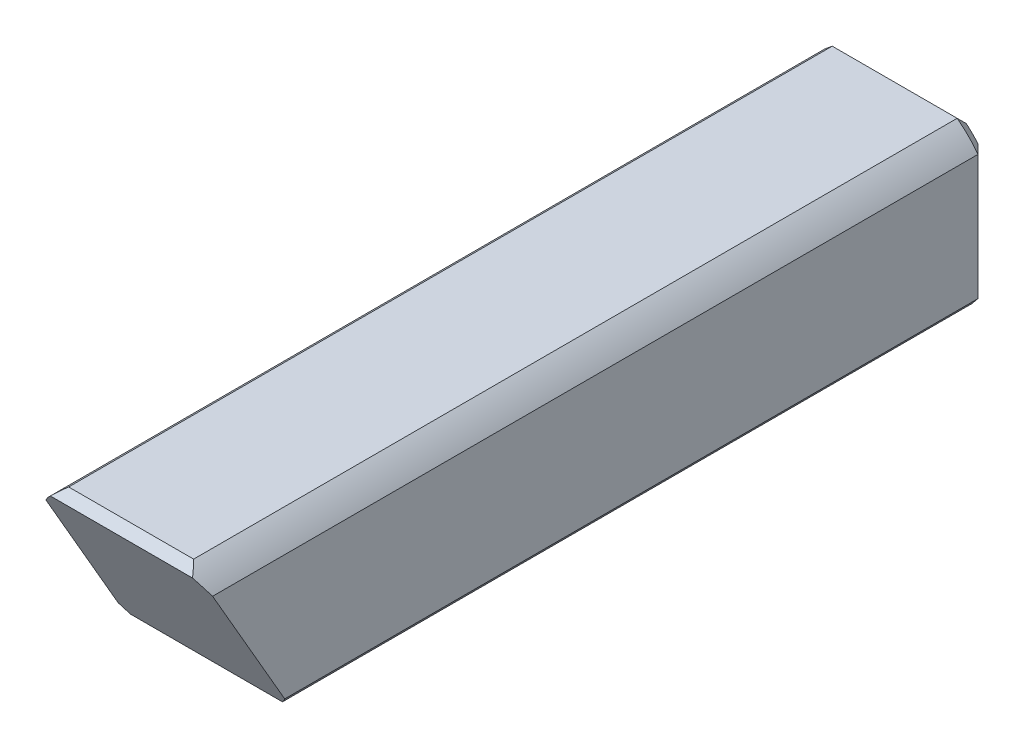
ISO-10303-21;
HEADER;
FILE_DESCRIPTION(('STEP AP214'),'2;1');
FILE_NAME('part.step','',(''),(''),'','','');
FILE_SCHEMA(('AUTOMOTIVE_DESIGN { 1 0 10303 214 1 1 1 1 }'));
ENDSEC;
DATA;
#1=APPLICATION_CONTEXT('core data for automotive mechanical design processes');
#2=APPLICATION_PROTOCOL_DEFINITION('international standard','automotive_design',2000,#1);
#3=PRODUCT_CONTEXT('',#1,'mechanical');
#4=PRODUCT('Part','Part','',(#3));
#5=PRODUCT_RELATED_PRODUCT_CATEGORY('part','',(#4));
#6=PRODUCT_DEFINITION_FORMATION('','',#4);
#7=PRODUCT_DEFINITION_CONTEXT('part definition',#1,'design');
#8=PRODUCT_DEFINITION('design','',#6,#7);
#9=PRODUCT_DEFINITION_SHAPE('','',#8);
#10=(LENGTH_UNIT() NAMED_UNIT(*) SI_UNIT(.MILLI.,.METRE.));
#11=(NAMED_UNIT(*) PLANE_ANGLE_UNIT() SI_UNIT($,.RADIAN.));
#12=(NAMED_UNIT(*) SI_UNIT($,.STERADIAN.) SOLID_ANGLE_UNIT());
#13=UNCERTAINTY_MEASURE_WITH_UNIT(LENGTH_MEASURE(1.E-05),#10,'distance_accuracy_value','');
#14=(GEOMETRIC_REPRESENTATION_CONTEXT(3) GLOBAL_UNCERTAINTY_ASSIGNED_CONTEXT((#13)) GLOBAL_UNIT_ASSIGNED_CONTEXT((#10,
#11,#12)) REPRESENTATION_CONTEXT('',''));
#15=CARTESIAN_POINT('',(0.,0.,0.));
#16=DIRECTION('',(0.,0.,1.));
#17=DIRECTION('',(1.,0.,0.));
#18=AXIS2_PLACEMENT_3D('',#15,#16,#17);
#19=CARTESIAN_POINT('',(-30.,30.,285.));
#20=DIRECTION('',(1.,0.,0.));
#21=DIRECTION('',(0.,1.,0.));
#22=AXIS2_PLACEMENT_3D('',#19,#20,#21);
#23=PLANE('',#22);
#24=DIRECTION('',(0.,0.,-1.));
#25=VECTOR('',#24,1.);
#26=CARTESIAN_POINT('',(-30.,22.5,285.));
#27=LINE('',#26,#25);
#28=CARTESIAN_POINT('',(-30.,22.5,4.99999999999995));
#29=VERTEX_POINT('',#28);
#30=CARTESIAN_POINT('',(-30.,22.5,280.669872981078));
#31=VERTEX_POINT('',#30);
#32=EDGE_CURVE('E332',#29,#31,#27,.F.);
#33=ORIENTED_EDGE('',*,*,#32,.F.);
#34=DIRECTION('',(0.,-1.,0.));
#35=VECTOR('',#34,1.);
#36=CARTESIAN_POINT('',(-30.,30.,4.99999999999995));
#37=LINE('',#36,#35);
#38=CARTESIAN_POINT('',(-30.,-22.5,4.99999999999995));
#39=VERTEX_POINT('',#38);
#40=EDGE_CURVE('E162',#29,#39,#37,.T.);
#41=ORIENTED_EDGE('',*,*,#40,.T.);
#42=DIRECTION('',(0.,0.,-1.));
#43=VECTOR('',#42,1.);
#44=CARTESIAN_POINT('',(-30.,-22.5,285.));
#45=LINE('',#44,#43);
#46=CARTESIAN_POINT('',(-30.,-22.5,254.689110867545));
#47=VERTEX_POINT('',#46);
#48=EDGE_CURVE('E146',#47,#39,#45,.T.);
#49=ORIENTED_EDGE('',*,*,#48,.F.);
#50=DIRECTION('',(0.,-0.86602540378444,-0.499999999999998));
#51=VECTOR('',#50,1.);
#52=CARTESIAN_POINT('',(-30.,30.,285.));
#53=LINE('',#52,#51);
#54=EDGE_CURVE('E155',#31,#47,#53,.T.);
#55=ORIENTED_EDGE('',*,*,#54,.F.);
#56=EDGE_LOOP('',(#33,#41,#49,#55));
#57=FACE_BOUND('',#56,.T.);
#58=ADVANCED_FACE('F35',(#57),#23,.F.);
#59=CARTESIAN_POINT('',(-30.,-30.,285.));
#60=DIRECTION('',(0.,1.,0.));
#61=DIRECTION('',(0.,0.,1.));
#62=AXIS2_PLACEMENT_3D('',#59,#60,#61);
#63=PLANE('',#62);
#64=DIRECTION('',(0.,0.,-1.));
#65=VECTOR('',#64,1.);
#66=CARTESIAN_POINT('',(-22.5,-30.,285.));
#67=LINE('',#66,#65);
#68=CARTESIAN_POINT('',(-22.5,-30.,4.99999999999995));
#69=VERTEX_POINT('',#68);
#70=CARTESIAN_POINT('',(-22.5,-30.,247.358983848623));
#71=VERTEX_POINT('',#70);
#72=EDGE_CURVE('E164',#69,#71,#67,.F.);
#73=ORIENTED_EDGE('',*,*,#72,.F.);
#74=DIRECTION('',(1.,0.,0.));
#75=VECTOR('',#74,1.);
#76=CARTESIAN_POINT('',(-30.,-30.,4.99999999999995));
#77=LINE('',#76,#75);
#78=CARTESIAN_POINT('',(22.5,-30.,4.99999999999995));
#79=VERTEX_POINT('',#78);
#80=EDGE_CURVE('E220',#69,#79,#77,.T.);
#81=ORIENTED_EDGE('',*,*,#80,.T.);
#82=DIRECTION('',(0.,0.,-1.));
#83=VECTOR('',#82,1.);
#84=CARTESIAN_POINT('',(22.5,-30.,285.));
#85=LINE('',#84,#83);
#86=CARTESIAN_POINT('',(22.5,-30.,247.358983848623));
#87=VERTEX_POINT('',#86);
#88=EDGE_CURVE('E172',#87,#79,#85,.T.);
#89=ORIENTED_EDGE('',*,*,#88,.F.);
#90=DIRECTION('',(-1.,0.,0.));
#91=VECTOR('',#90,1.);
#92=CARTESIAN_POINT('',(-22.5,-30.,247.358983848623));
#93=LINE('',#92,#91);
#94=EDGE_CURVE('E183',#87,#71,#93,.T.);
#95=ORIENTED_EDGE('',*,*,#94,.T.);
#96=EDGE_LOOP('',(#73,#81,#89,#95));
#97=FACE_BOUND('',#96,.T.);
#98=ADVANCED_FACE('F308',(#97),#63,.F.);
#99=CARTESIAN_POINT('',(30.,30.,285.));
#100=DIRECTION('',(1.,0.,0.));
#101=DIRECTION('',(0.,1.,0.));
#102=AXIS2_PLACEMENT_3D('',#99,#100,#101);
#103=PLANE('',#102);
#104=DIRECTION('',(0.,0.,-1.));
#105=VECTOR('',#104,1.);
#106=CARTESIAN_POINT('',(30.,-22.5,285.));
#107=LINE('',#106,#105);
#108=CARTESIAN_POINT('',(30.,-22.5,254.689110867545));
#109=VERTEX_POINT('',#108);
#110=CARTESIAN_POINT('',(30.,-22.5,4.99999999999995));
#111=VERTEX_POINT('',#110);
#112=EDGE_CURVE('E336',#109,#111,#107,.T.);
#113=ORIENTED_EDGE('',*,*,#112,.T.);
#114=DIRECTION('',(0.,1.,0.));
#115=VECTOR('',#114,1.);
#116=CARTESIAN_POINT('',(30.,22.5,4.99999999999995));
#117=LINE('',#116,#115);
#118=CARTESIAN_POINT('',(30.,22.5,4.99999999999995));
#119=VERTEX_POINT('',#118);
#120=EDGE_CURVE('E49',#111,#119,#117,.T.);
#121=ORIENTED_EDGE('',*,*,#120,.T.);
#122=DIRECTION('',(0.,0.,-1.));
#123=VECTOR('',#122,1.);
#124=CARTESIAN_POINT('',(30.,22.5,285.));
#125=LINE('',#124,#123);
#126=CARTESIAN_POINT('',(30.,22.5,280.669872981078));
#127=VERTEX_POINT('',#126);
#128=EDGE_CURVE('E338',#119,#127,#125,.F.);
#129=ORIENTED_EDGE('',*,*,#128,.T.);
#130=DIRECTION('',(0.,-0.86602540378444,-0.499999999999998));
#131=VECTOR('',#130,1.);
#132=CARTESIAN_POINT('',(30.,30.,285.));
#133=LINE('',#132,#131);
#134=EDGE_CURVE('E169',#127,#109,#133,.T.);
#135=ORIENTED_EDGE('',*,*,#134,.T.);
#136=EDGE_LOOP('',(#113,#121,#129,#135));
#137=FACE_BOUND('',#136,.T.);
#138=ADVANCED_FACE('F313',(#137),#103,.T.);
#139=CARTESIAN_POINT('',(-30.,30.,285.));
#140=DIRECTION('',(0.,1.,0.));
#141=DIRECTION('',(0.,0.,1.));
#142=AXIS2_PLACEMENT_3D('',#139,#140,#141);
#143=PLANE('',#142);
#144=DIRECTION('',(0.,0.,-1.));
#145=VECTOR('',#144,1.);
#146=CARTESIAN_POINT('',(22.5,30.,285.));
#147=LINE('',#146,#145);
#148=CARTESIAN_POINT('',(22.5,30.,280.));
#149=VERTEX_POINT('',#148);
#150=CARTESIAN_POINT('',(22.5,30.,4.99999999999995));
#151=VERTEX_POINT('',#150);
#152=EDGE_CURVE('E343',#149,#151,#147,.T.);
#153=ORIENTED_EDGE('',*,*,#152,.T.);
#154=DIRECTION('',(-1.,0.,0.));
#155=VECTOR('',#154,1.);
#156=CARTESIAN_POINT('',(-22.5,30.,4.99999999999995));
#157=LINE('',#156,#155);
#158=CARTESIAN_POINT('',(-22.5,30.,4.99999999999995));
#159=VERTEX_POINT('',#158);
#160=EDGE_CURVE('E212',#151,#159,#157,.T.);
#161=ORIENTED_EDGE('',*,*,#160,.T.);
#162=DIRECTION('',(0.,0.,-1.));
#163=VECTOR('',#162,1.);
#164=CARTESIAN_POINT('',(-22.5,30.,285.));
#165=LINE('',#164,#163);
#166=CARTESIAN_POINT('',(-22.5,30.,280.));
#167=VERTEX_POINT('',#166);
#168=EDGE_CURVE('E163',#159,#167,#165,.F.);
#169=ORIENTED_EDGE('',*,*,#168,.T.);
#170=DIRECTION('',(1.,0.,0.));
#171=VECTOR('',#170,1.);
#172=CARTESIAN_POINT('',(-30.,30.,280.));
#173=LINE('',#172,#171);
#174=EDGE_CURVE('E187',#167,#149,#173,.T.);
#175=ORIENTED_EDGE('',*,*,#174,.T.);
#176=EDGE_LOOP('',(#153,#161,#169,#175));
#177=FACE_BOUND('',#176,.T.);
#178=ADVANCED_FACE('F349',(#177),#143,.T.);
#179=CARTESIAN_POINT('',(0.,0.,0.));
#180=DIRECTION('',(0.,0.,1.));
#181=DIRECTION('',(1.,0.,0.));
#182=AXIS2_PLACEMENT_3D('',#179,#180,#181);
#183=PLANE('',#182);
#184=CARTESIAN_POINT('',(0.,0.,0.));
#185=DIRECTION('',(0.,0.,1.));
#186=DIRECTION('',(1.,0.,0.));
#187=AXIS2_PLACEMENT_3D('',#184,#185,#186);
#188=CIRCLE('',#187,32.5000000000001);
#189=CARTESIAN_POINT('',(-25.0000000000001,20.7665596572952,0.));
#190=VERTEX_POINT('',#189);
#191=CARTESIAN_POINT('',(-20.7665596572952,25.0000000000001,0.));
#192=VERTEX_POINT('',#191);
#193=EDGE_CURVE('E207',#190,#192,#188,.F.);
#194=ORIENTED_EDGE('',*,*,#193,.T.);
#195=DIRECTION('',(1.,0.,0.));
#196=VECTOR('',#195,1.);
#197=CARTESIAN_POINT('',(22.5,25.0000000000001,0.));
#198=LINE('',#197,#196);
#199=CARTESIAN_POINT('',(20.7665596572952,25.0000000000001,0.));
#200=VERTEX_POINT('',#199);
#201=EDGE_CURVE('E209',#192,#200,#198,.T.);
#202=ORIENTED_EDGE('',*,*,#201,.T.);
#203=CARTESIAN_POINT('',(0.,0.,0.));
#204=DIRECTION('',(0.,0.,1.));
#205=DIRECTION('',(1.,0.,0.));
#206=AXIS2_PLACEMENT_3D('',#203,#204,#205);
#207=CIRCLE('',#206,32.5000000000001);
#208=CARTESIAN_POINT('',(25.0000000000001,20.7665596572952,0.));
#209=VERTEX_POINT('',#208);
#210=EDGE_CURVE('E195',#200,#209,#207,.F.);
#211=ORIENTED_EDGE('',*,*,#210,.T.);
#212=DIRECTION('',(0.,-1.,0.));
#213=VECTOR('',#212,1.);
#214=CARTESIAN_POINT('',(25.0000000000001,-22.5,0.));
#215=LINE('',#214,#213);
#216=CARTESIAN_POINT('',(25.0000000000001,-20.7665596572952,0.));
#217=VERTEX_POINT('',#216);
#218=EDGE_CURVE('E197',#209,#217,#215,.T.);
#219=ORIENTED_EDGE('',*,*,#218,.T.);
#220=CARTESIAN_POINT('',(0.,0.,0.));
#221=DIRECTION('',(0.,0.,1.));
#222=DIRECTION('',(1.,0.,0.));
#223=AXIS2_PLACEMENT_3D('',#220,#221,#222);
#224=CIRCLE('',#223,32.5000000000001);
#225=CARTESIAN_POINT('',(20.7665596572952,-25.0000000000001,0.));
#226=VERTEX_POINT('',#225);
#227=EDGE_CURVE('E199',#217,#226,#224,.F.);
#228=ORIENTED_EDGE('',*,*,#227,.T.);
#229=DIRECTION('',(-1.,0.,0.));
#230=VECTOR('',#229,1.);
#231=CARTESIAN_POINT('',(0.,-25.0000000000001,0.));
#232=LINE('',#231,#230);
#233=CARTESIAN_POINT('',(-20.7665596572952,-25.0000000000001,0.));
#234=VERTEX_POINT('',#233);
#235=EDGE_CURVE('E201',#226,#234,#232,.T.);
#236=ORIENTED_EDGE('',*,*,#235,.T.);
#237=CARTESIAN_POINT('',(0.,0.,0.));
#238=DIRECTION('',(0.,0.,1.));
#239=DIRECTION('',(1.,0.,0.));
#240=AXIS2_PLACEMENT_3D('',#237,#238,#239);
#241=CIRCLE('',#240,32.5000000000001);
#242=CARTESIAN_POINT('',(-25.0000000000001,-20.7665596572952,0.));
#243=VERTEX_POINT('',#242);
#244=EDGE_CURVE('E203',#234,#243,#241,.F.);
#245=ORIENTED_EDGE('',*,*,#244,.T.);
#246=DIRECTION('',(0.,1.,0.));
#247=VECTOR('',#246,1.);
#248=CARTESIAN_POINT('',(-25.0000000000001,0.,0.));
#249=LINE('',#248,#247);
#250=EDGE_CURVE('E205',#243,#190,#249,.T.);
#251=ORIENTED_EDGE('',*,*,#250,.T.);
#252=EDGE_LOOP('',(#194,#202,#211,#219,#228,#236,#245,#251));
#253=FACE_BOUND('',#252,.T.);
#254=ADVANCED_FACE('F381',(#253),#183,.F.);
#255=CARTESIAN_POINT('',(-64.9999999999998,30.,285.));
#256=DIRECTION('',(0.,-0.499999999999998,0.86602540378444));
#257=DIRECTION('',(0.,-0.86602540378444,-0.499999999999998));
#258=AXIS2_PLACEMENT_3D('',#255,#256,#257);
#259=PLANE('',#258);
#260=CARTESIAN_POINT('',(0.,0.,267.679491924311));
#261=DIRECTION('',(0.,-0.499999999999998,0.86602540378444));
#262=DIRECTION('',(0.,-0.86602540378444,-0.499999999999998));
#263=AXIS2_PLACEMENT_3D('',#260,#261,#262);
#264=ELLIPSE('',#263,43.3012701892219,37.5);
#265=CARTESIAN_POINT('',(-27.3369277925543,-25.6698729810779,252.858983848623));
#266=VERTEX_POINT('',#265);
#267=EDGE_CURVE('E143',#47,#266,#264,.T.);
#268=ORIENTED_EDGE('',*,*,#267,.T.);
#269=DIRECTION('',(1.,0.,0.));
#270=VECTOR('',#269,1.);
#271=CARTESIAN_POINT('',(22.5,-25.6698729810779,252.858983848623));
#272=LINE('',#271,#270);
#273=CARTESIAN_POINT('',(27.3369277925543,-25.6698729810779,252.858983848623));
#274=VERTEX_POINT('',#273);
#275=EDGE_CURVE('E178',#266,#274,#272,.T.);
#276=ORIENTED_EDGE('',*,*,#275,.T.);
#277=EDGE_CURVE('E179',#274,#109,#264,.T.);
#278=ORIENTED_EDGE('',*,*,#277,.T.);
#279=ORIENTED_EDGE('',*,*,#134,.F.);
#280=CARTESIAN_POINT('',(25.600479930681,27.4019237886467,283.5));
#281=VERTEX_POINT('',#280);
#282=EDGE_CURVE('E157',#127,#281,#264,.T.);
#283=ORIENTED_EDGE('',*,*,#282,.T.);
#284=DIRECTION('',(-1.,0.,0.));
#285=VECTOR('',#284,1.);
#286=CARTESIAN_POINT('',(-64.9999999999998,27.4019237886467,283.5));
#287=LINE('',#286,#285);
#288=CARTESIAN_POINT('',(-25.600479930681,27.4019237886467,283.5));
#289=VERTEX_POINT('',#288);
#290=EDGE_CURVE('E176',#281,#289,#287,.T.);
#291=ORIENTED_EDGE('',*,*,#290,.T.);
#292=EDGE_CURVE('E154',#289,#31,#264,.T.);
#293=ORIENTED_EDGE('',*,*,#292,.T.);
#294=ORIENTED_EDGE('',*,*,#54,.T.);
#295=EDGE_LOOP('',(#268,#276,#278,#279,#283,#291,#293,#294));
#296=FACE_BOUND('',#295,.T.);
#297=ADVANCED_FACE('F167',(#296),#259,.T.);
#298=CARTESIAN_POINT('',(0.,0.,285.));
#299=DIRECTION('',(0.,0.,-1.));
#300=DIRECTION('',(-1.,0.,0.));
#301=AXIS2_PLACEMENT_3D('',#298,#299,#300);
#302=CYLINDRICAL_SURFACE('',#301,37.5);
#303=ORIENTED_EDGE('',*,*,#48,.T.);
#304=CARTESIAN_POINT('',(0.,0.,4.99999999999995));
#305=DIRECTION('',(0.,0.,1.));
#306=DIRECTION('',(1.,0.,0.));
#307=AXIS2_PLACEMENT_3D('',#304,#305,#306);
#308=CIRCLE('',#307,37.5);
#309=EDGE_CURVE('E218',#39,#69,#308,.T.);
#310=ORIENTED_EDGE('',*,*,#309,.T.);
#311=ORIENTED_EDGE('',*,*,#72,.T.);
#312=CARTESIAN_POINT('',(0.,0.,285.464101615138));
#313=DIRECTION('',(0.,-0.785714285714287,0.61858957413174));
#314=DIRECTION('',(0.,-0.61858957413174,-0.785714285714287));
#315=AXIS2_PLACEMENT_3D('',#312,#313,#314);
#316=ELLIPSE('',#315,60.6217782649109,37.5);
#317=EDGE_CURVE('E149',#71,#266,#316,.F.);
#318=ORIENTED_EDGE('',*,*,#317,.T.);
#319=ORIENTED_EDGE('',*,*,#267,.F.);
#320=EDGE_LOOP('',(#303,#310,#311,#318,#319));
#321=FACE_BOUND('',#320,.T.);
#322=ADVANCED_FACE('F145',(#321),#302,.T.);
#323=ORIENTED_EDGE('',*,*,#168,.F.);
#324=CARTESIAN_POINT('',(0.,0.,4.99999999999995));
#325=DIRECTION('',(0.,0.,1.));
#326=DIRECTION('',(1.,0.,0.));
#327=AXIS2_PLACEMENT_3D('',#324,#325,#326);
#328=CIRCLE('',#327,37.5);
#329=EDGE_CURVE('E215',#159,#29,#328,.T.);
#330=ORIENTED_EDGE('',*,*,#329,.T.);
#331=ORIENTED_EDGE('',*,*,#32,.T.);
#332=ORIENTED_EDGE('',*,*,#292,.F.);
#333=CARTESIAN_POINT('',(0.,0.,320.414518843274));
#334=DIRECTION('',(0.,-0.802955068546969,-0.596039560679266));
#335=DIRECTION('',(0.,0.596039560679266,-0.802955068546969));
#336=AXIS2_PLACEMENT_3D('',#333,#334,#335);
#337=ELLIPSE('',#336,62.91528696059,37.5);
#338=EDGE_CURVE('E192',#289,#167,#337,.T.);
#339=ORIENTED_EDGE('',*,*,#338,.T.);
#340=EDGE_LOOP('',(#323,#330,#331,#332,#339));
#341=FACE_BOUND('',#340,.T.);
#342=ADVANCED_FACE('F331',(#341),#302,.T.);
#343=ORIENTED_EDGE('',*,*,#128,.F.);
#344=CARTESIAN_POINT('',(0.,0.,4.99999999999995));
#345=DIRECTION('',(0.,0.,1.));
#346=DIRECTION('',(1.,0.,0.));
#347=AXIS2_PLACEMENT_3D('',#344,#345,#346);
#348=CIRCLE('',#347,37.5);
#349=EDGE_CURVE('E12',#119,#151,#348,.T.);
#350=ORIENTED_EDGE('',*,*,#349,.T.);
#351=ORIENTED_EDGE('',*,*,#152,.F.);
#352=CARTESIAN_POINT('',(0.,0.,320.414518843274));
#353=DIRECTION('',(0.,-0.802955068546969,-0.596039560679266));
#354=DIRECTION('',(0.,0.596039560679266,-0.802955068546969));
#355=AXIS2_PLACEMENT_3D('',#352,#353,#354);
#356=ELLIPSE('',#355,62.91528696059,37.5);
#357=EDGE_CURVE('E190',#149,#281,#356,.T.);
#358=ORIENTED_EDGE('',*,*,#357,.T.);
#359=ORIENTED_EDGE('',*,*,#282,.F.);
#360=EDGE_LOOP('',(#343,#350,#351,#358,#359));
#361=FACE_BOUND('',#360,.T.);
#362=ADVANCED_FACE('F345',(#361),#302,.T.);
#363=ORIENTED_EDGE('',*,*,#88,.T.);
#364=CARTESIAN_POINT('',(0.,0.,4.99999999999995));
#365=DIRECTION('',(0.,0.,1.));
#366=DIRECTION('',(1.,0.,0.));
#367=AXIS2_PLACEMENT_3D('',#364,#365,#366);
#368=CIRCLE('',#367,37.5);
#369=EDGE_CURVE('E64',#79,#111,#368,.T.);
#370=ORIENTED_EDGE('',*,*,#369,.T.);
#371=ORIENTED_EDGE('',*,*,#112,.F.);
#372=ORIENTED_EDGE('',*,*,#277,.F.);
#373=CARTESIAN_POINT('',(0.,0.,285.464101615138));
#374=DIRECTION('',(0.,-0.785714285714287,0.61858957413174));
#375=DIRECTION('',(0.,-0.61858957413174,-0.785714285714287));
#376=AXIS2_PLACEMENT_3D('',#373,#374,#375);
#377=ELLIPSE('',#376,60.6217782649109,37.5);
#378=EDGE_CURVE('E181',#274,#87,#377,.F.);
#379=ORIENTED_EDGE('',*,*,#378,.T.);
#380=EDGE_LOOP('',(#363,#370,#371,#372,#379));
#381=FACE_BOUND('',#380,.T.);
#382=ADVANCED_FACE('F320',(#381),#302,.T.);
#383=CARTESIAN_POINT('',(-64.9999999999998,-25.6698729810779,252.858983848623));
#384=DIRECTION('',(0.,-0.785714285714287,0.61858957413174));
#385=DIRECTION('',(-1.,0.,0.));
#386=AXIS2_PLACEMENT_3D('',#383,#384,#385);
#387=PLANE('',#386);
#388=ORIENTED_EDGE('',*,*,#317,.F.);
#389=ORIENTED_EDGE('',*,*,#94,.F.);
#390=ORIENTED_EDGE('',*,*,#378,.F.);
#391=ORIENTED_EDGE('',*,*,#275,.F.);
#392=EDGE_LOOP('',(#388,#389,#390,#391));
#393=FACE_BOUND('',#392,.T.);
#394=ADVANCED_FACE('F318',(#393),#387,.T.);
#395=CARTESIAN_POINT('',(-30.,30.,280.));
#396=DIRECTION('',(0.,-0.802955068546969,-0.596039560679266));
#397=DIRECTION('',(1.,0.,0.));
#398=AXIS2_PLACEMENT_3D('',#395,#396,#397);
#399=PLANE('',#398);
#400=ORIENTED_EDGE('',*,*,#338,.F.);
#401=ORIENTED_EDGE('',*,*,#290,.F.);
#402=ORIENTED_EDGE('',*,*,#357,.F.);
#403=ORIENTED_EDGE('',*,*,#174,.F.);
#404=EDGE_LOOP('',(#400,#401,#402,#403));
#405=FACE_BOUND('',#404,.T.);
#406=ADVANCED_FACE('F304',(#405),#399,.F.);
#407=CARTESIAN_POINT('',(-30.,-30.,4.99999999999995));
#408=DIRECTION('',(0.,0.707106781186551,0.707106781186544));
#409=DIRECTION('',(1.,0.,0.));
#410=AXIS2_PLACEMENT_3D('',#407,#408,#409);
#411=PLANE('',#410);
#412=CARTESIAN_POINT('',(22.5,-30.,4.99999999999995));
#413=CARTESIAN_POINT('',(22.3608075202423,-29.5824290363737,4.5824290363736));
#414=CARTESIAN_POINT('',(22.2203953427842,-29.1650608878028,4.1650608878027));
#415=CARTESIAN_POINT('',(21.9369934435473,-28.3307719209598,3.33077192095973));
#416=CARTESIAN_POINT('',(21.7940037771281,-27.9138510932834,2.91385109328335));
#417=CARTESIAN_POINT('',(21.5053022610169,-27.0804790195449,2.08047901954486));
#418=CARTESIAN_POINT('',(21.3595904013306,-26.6640277752128,1.66402777521275));
#419=CARTESIAN_POINT('',(21.0652799048296,-25.831626235387,0.831626235386917));
#420=CARTESIAN_POINT('',(20.9166812061406,-25.4156759508338,0.415675950833753));
#421=CARTESIAN_POINT('',(20.7665596572952,-25.0000000000001,0.));
#422=B_SPLINE_CURVE_WITH_KNOTS('',3,(#412,#413,#414,#415,#416,#417,#418,#419,#420,#421),
.UNSPECIFIED.,.F.,.F.,(4,2,2,2,4),(0.,1.82015075351346,3.64026246014196,5.46038085050676,
7.28053829503265),.UNSPECIFIED.);
#423=EDGE_CURVE('E289',#79,#226,#422,.T.);
#424=ORIENTED_EDGE('',*,*,#423,.F.);
#425=ORIENTED_EDGE('',*,*,#80,.F.);
#426=CARTESIAN_POINT('',(-22.5,-30.,4.99999999999995));
#427=CARTESIAN_POINT('',(-22.3608075202423,-29.5824290363737,4.5824290363736));
#428=CARTESIAN_POINT('',(-22.2203953427842,-29.1650608878028,4.1650608878027));
#429=CARTESIAN_POINT('',(-21.9369934435473,-28.3307719209598,3.33077192095973));
#430=CARTESIAN_POINT('',(-21.7940037771281,-27.9138510932834,2.91385109328335));
#431=CARTESIAN_POINT('',(-21.5053022610169,-27.0804790195449,2.08047901954486));
#432=CARTESIAN_POINT('',(-21.3595904013306,-26.6640277752128,1.66402777521275));
#433=CARTESIAN_POINT('',(-21.0652799048296,-25.831626235387,0.831626235386917));
#434=CARTESIAN_POINT('',(-20.9166812061406,-25.4156759508338,0.415675950833753));
#435=CARTESIAN_POINT('',(-20.7665596572952,-25.0000000000001,0.));
#436=B_SPLINE_CURVE_WITH_KNOTS('',3,(#426,#427,#428,#429,#430,#431,#432,#433,#434,#435),
.UNSPECIFIED.,.F.,.F.,(4,2,2,2,4),(0.,1.82015075351346,3.64026246014196,5.46038085050676,
7.28053829503265),.UNSPECIFIED.);
#437=EDGE_CURVE('E40',#234,#69,#436,.F.);
#438=ORIENTED_EDGE('',*,*,#437,.F.);
#439=ORIENTED_EDGE('',*,*,#235,.F.);
#440=EDGE_LOOP('',(#424,#425,#438,#439));
#441=FACE_BOUND('',#440,.T.);
#442=ADVANCED_FACE('F37',(#441),#411,.F.);
#443=CARTESIAN_POINT('',(0.,0.,0.));
#444=DIRECTION('',(0.,0.,1.));
#445=DIRECTION('',(1.,0.,0.));
#446=AXIS2_PLACEMENT_3D('',#443,#444,#445);
#447=CONICAL_SURFACE('',#446,32.5000000000001,0.785398163397444);
#448=ORIENTED_EDGE('',*,*,#437,.T.);
#449=ORIENTED_EDGE('',*,*,#309,.F.);
#450=CARTESIAN_POINT('',(-30.,-22.5,4.99999999999995));
#451=CARTESIAN_POINT('',(-29.5824290363736,-22.3608075202423,4.5824290363736));
#452=CARTESIAN_POINT('',(-29.1650608878028,-22.2203953427842,4.1650608878027));
#453=CARTESIAN_POINT('',(-28.3307719209598,-21.9369934435473,3.33077192095973));
#454=CARTESIAN_POINT('',(-27.9138510932834,-21.7940037771281,2.91385109328335));
#455=CARTESIAN_POINT('',(-27.0804790195449,-21.5053022610169,2.08047901954486));
#456=CARTESIAN_POINT('',(-26.6640277752128,-21.3595904013306,1.66402777521276));
#457=CARTESIAN_POINT('',(-25.831626235387,-21.0652799048296,0.831626235386921));
#458=CARTESIAN_POINT('',(-25.4156759508338,-20.9166812061406,0.415675950833756));
#459=CARTESIAN_POINT('',(-25.0000000000001,-20.7665596572952,0.));
#460=B_SPLINE_CURVE_WITH_KNOTS('',3,(#450,#451,#452,#453,#454,#455,#456,#457,#458,#459),
.UNSPECIFIED.,.F.,.F.,(4,2,2,2,4),(0.,1.82015075351346,3.64026246014196,5.46038085050676,
7.28053829503264),.UNSPECIFIED.);
#461=EDGE_CURVE('E283',#243,#39,#460,.F.);
#462=ORIENTED_EDGE('',*,*,#461,.F.);
#463=ORIENTED_EDGE('',*,*,#244,.F.);
#464=EDGE_LOOP('',(#448,#449,#462,#463));
#465=FACE_BOUND('',#464,.T.);
#466=ADVANCED_FACE('F294',(#465),#447,.T.);
#467=CARTESIAN_POINT('',(0.,0.,0.));
#468=DIRECTION('',(0.,0.,1.));
#469=DIRECTION('',(1.,0.,0.));
#470=AXIS2_PLACEMENT_3D('',#467,#468,#469);
#471=CONICAL_SURFACE('',#470,32.5000000000001,0.785398163397444);
#472=ORIENTED_EDGE('',*,*,#423,.T.);
#473=ORIENTED_EDGE('',*,*,#227,.F.);
#474=CARTESIAN_POINT('',(30.,-22.5,4.99999999999995));
#475=CARTESIAN_POINT('',(29.5824290363737,-22.3608075202423,4.5824290363736));
#476=CARTESIAN_POINT('',(29.1650608878028,-22.2203953427842,4.1650608878027));
#477=CARTESIAN_POINT('',(28.3307719209598,-21.9369934435473,3.33077192095973));
#478=CARTESIAN_POINT('',(27.9138510932834,-21.7940037771281,2.91385109328335));
#479=CARTESIAN_POINT('',(27.0804790195449,-21.5053022610169,2.08047901954486));
#480=CARTESIAN_POINT('',(26.6640277752128,-21.3595904013306,1.66402777521275));
#481=CARTESIAN_POINT('',(25.831626235387,-21.0652799048296,0.831626235386918));
#482=CARTESIAN_POINT('',(25.4156759508339,-20.9166812061406,0.415675950833754));
#483=CARTESIAN_POINT('',(25.0000000000001,-20.7665596572952,0.));
#484=B_SPLINE_CURVE_WITH_KNOTS('',3,(#474,#475,#476,#477,#478,#479,#480,#481,#482,#483),
.UNSPECIFIED.,.F.,.F.,(4,2,2,2,4),(0.,1.82015075351346,3.64026246014196,5.46038085050676,
7.28053829503264),.UNSPECIFIED.);
#485=EDGE_CURVE('E264',#111,#217,#484,.T.);
#486=ORIENTED_EDGE('',*,*,#485,.F.);
#487=ORIENTED_EDGE('',*,*,#369,.F.);
#488=EDGE_LOOP('',(#472,#473,#486,#487));
#489=FACE_BOUND('',#488,.T.);
#490=ADVANCED_FACE('F279',(#489),#471,.T.);
#491=CARTESIAN_POINT('',(-30.,30.,4.99999999999995));
#492=DIRECTION('',(0.707106781186551,0.,0.707106781186544));
#493=DIRECTION('',(0.,-1.,0.));
#494=AXIS2_PLACEMENT_3D('',#491,#492,#493);
#495=PLANE('',#494);
#496=ORIENTED_EDGE('',*,*,#461,.T.);
#497=ORIENTED_EDGE('',*,*,#40,.F.);
#498=CARTESIAN_POINT('',(-30.,22.5,4.99999999999995));
#499=CARTESIAN_POINT('',(-29.5824290363737,22.3608075202423,4.5824290363736));
#500=CARTESIAN_POINT('',(-29.1650608878028,22.2203953427842,4.1650608878027));
#501=CARTESIAN_POINT('',(-28.3307719209598,21.9369934435473,3.33077192095973));
#502=CARTESIAN_POINT('',(-27.9138510932834,21.7940037771281,2.91385109328335));
#503=CARTESIAN_POINT('',(-27.0804790195449,21.5053022610169,2.08047901954486));
#504=CARTESIAN_POINT('',(-26.6640277752128,21.3595904013306,1.66402777521275));
#505=CARTESIAN_POINT('',(-25.831626235387,21.0652799048296,0.831626235386918));
#506=CARTESIAN_POINT('',(-25.4156759508338,20.9166812061406,0.415675950833753));
#507=CARTESIAN_POINT('',(-25.0000000000001,20.7665596572952,0.));
#508=B_SPLINE_CURVE_WITH_KNOTS('',3,(#498,#499,#500,#501,#502,#503,#504,#505,#506,#507),
.UNSPECIFIED.,.F.,.F.,(4,2,2,2,4),(0.,1.82015075351345,3.64026246014196,5.46038085050676,
7.28053829503265),.UNSPECIFIED.);
#509=EDGE_CURVE('E257',#190,#29,#508,.F.);
#510=ORIENTED_EDGE('',*,*,#509,.F.);
#511=ORIENTED_EDGE('',*,*,#250,.F.);
#512=EDGE_LOOP('',(#496,#497,#510,#511));
#513=FACE_BOUND('',#512,.T.);
#514=ADVANCED_FACE('F276',(#513),#495,.F.);
#515=CARTESIAN_POINT('',(25.0000000000001,0.,0.));
#516=DIRECTION('',(0.707106781186551,0.,-0.707106781186544));
#517=DIRECTION('',(0.,1.,0.));
#518=AXIS2_PLACEMENT_3D('',#515,#516,#517);
#519=PLANE('',#518);
#520=ORIENTED_EDGE('',*,*,#485,.T.);
#521=ORIENTED_EDGE('',*,*,#218,.F.);
#522=CARTESIAN_POINT('',(30.,22.5,4.99999999999995));
#523=CARTESIAN_POINT('',(29.5824290363737,22.3608075202423,4.5824290363736));
#524=CARTESIAN_POINT('',(29.1650608878028,22.2203953427842,4.1650608878027));
#525=CARTESIAN_POINT('',(28.3307719209598,21.9369934435473,3.33077192095973));
#526=CARTESIAN_POINT('',(27.9138510932834,21.7940037771281,2.91385109328335));
#527=CARTESIAN_POINT('',(27.0804790195449,21.5053022610169,2.08047901954486));
#528=CARTESIAN_POINT('',(26.6640277752128,21.3595904013306,1.66402777521275));
#529=CARTESIAN_POINT('',(25.831626235387,21.0652799048296,0.831626235386918));
#530=CARTESIAN_POINT('',(25.4156759508338,20.9166812061406,0.415675950833753));
#531=CARTESIAN_POINT('',(25.0000000000001,20.7665596572952,0.));
#532=B_SPLINE_CURVE_WITH_KNOTS('',3,(#522,#523,#524,#525,#526,#527,#528,#529,#530,#531),
.UNSPECIFIED.,.F.,.F.,(4,2,2,2,4),(0.,1.82015075351346,3.64026246014196,5.46038085050676,
7.28053829503264),.UNSPECIFIED.);
#533=EDGE_CURVE('E265',#119,#209,#532,.T.);
#534=ORIENTED_EDGE('',*,*,#533,.F.);
#535=ORIENTED_EDGE('',*,*,#120,.F.);
#536=EDGE_LOOP('',(#520,#521,#534,#535));
#537=FACE_BOUND('',#536,.T.);
#538=ADVANCED_FACE('F251',(#537),#519,.T.);
#539=CARTESIAN_POINT('',(0.,0.,0.));
#540=DIRECTION('',(0.,0.,1.));
#541=DIRECTION('',(1.,0.,0.));
#542=AXIS2_PLACEMENT_3D('',#539,#540,#541);
#543=CONICAL_SURFACE('',#542,32.5000000000001,0.785398163397444);
#544=ORIENTED_EDGE('',*,*,#509,.T.);
#545=ORIENTED_EDGE('',*,*,#329,.F.);
#546=CARTESIAN_POINT('',(-22.5,30.,4.99999999999995));
#547=CARTESIAN_POINT('',(-22.3608075202423,29.5824290363737,4.5824290363736));
#548=CARTESIAN_POINT('',(-22.2203953427842,29.1650608878028,4.1650608878027));
#549=CARTESIAN_POINT('',(-21.9369934435473,28.3307719209598,3.33077192095973));
#550=CARTESIAN_POINT('',(-21.7940037771281,27.9138510932834,2.91385109328335));
#551=CARTESIAN_POINT('',(-21.5053022610169,27.0804790195449,2.08047901954486));
#552=CARTESIAN_POINT('',(-21.3595904013306,26.6640277752128,1.66402777521275));
#553=CARTESIAN_POINT('',(-21.0652799048296,25.831626235387,0.831626235386917));
#554=CARTESIAN_POINT('',(-20.9166812061406,25.4156759508338,0.415675950833753));
#555=CARTESIAN_POINT('',(-20.7665596572952,25.0000000000001,0.));
#556=B_SPLINE_CURVE_WITH_KNOTS('',3,(#546,#547,#548,#549,#550,#551,#552,#553,#554,#555),
.UNSPECIFIED.,.F.,.F.,(4,2,2,2,4),(0.,1.82015075351346,3.64026246014196,5.46038085050676,
7.28053829503265),.UNSPECIFIED.);
#557=EDGE_CURVE('E232',#192,#159,#556,.F.);
#558=ORIENTED_EDGE('',*,*,#557,.F.);
#559=ORIENTED_EDGE('',*,*,#193,.F.);
#560=EDGE_LOOP('',(#544,#545,#558,#559));
#561=FACE_BOUND('',#560,.T.);
#562=ADVANCED_FACE('F246',(#561),#543,.T.);
#563=CARTESIAN_POINT('',(0.,0.,0.));
#564=DIRECTION('',(0.,0.,1.));
#565=DIRECTION('',(1.,0.,0.));
#566=AXIS2_PLACEMENT_3D('',#563,#564,#565);
#567=CONICAL_SURFACE('',#566,32.5000000000001,0.785398163397444);
#568=ORIENTED_EDGE('',*,*,#533,.T.);
#569=ORIENTED_EDGE('',*,*,#210,.F.);
#570=CARTESIAN_POINT('',(20.7665596572952,25.0000000000001,0.));
#571=CARTESIAN_POINT('',(20.9166812061406,25.4156759508338,0.415675950833754));
#572=CARTESIAN_POINT('',(21.0652799048296,25.831626235387,0.831626235386917));
#573=CARTESIAN_POINT('',(21.3595904013306,26.6640277752128,1.66402777521275));
#574=CARTESIAN_POINT('',(21.5053022610169,27.0804790195449,2.08047901954486));
#575=CARTESIAN_POINT('',(21.7940037771281,27.9138510932834,2.91385109328335));
#576=CARTESIAN_POINT('',(21.9369934435473,28.3307719209598,3.33077192095973));
#577=CARTESIAN_POINT('',(22.2203953427842,29.1650608878028,4.1650608878027));
#578=CARTESIAN_POINT('',(22.3608075202423,29.5824290363737,4.5824290363736));
#579=CARTESIAN_POINT('',(22.5,30.,4.99999999999995));
#580=B_SPLINE_CURVE_WITH_KNOTS('',3,(#570,#571,#572,#573,#574,#575,#576,#577,#578,#579),
.UNSPECIFIED.,.F.,.F.,(4,2,2,2,4),(0.,1.82015744452588,3.64027583489069,5.46038754151919,
7.28053829503265),.UNSPECIFIED.);
#581=EDGE_CURVE('E224',#151,#200,#580,.F.);
#582=ORIENTED_EDGE('',*,*,#581,.F.);
#583=ORIENTED_EDGE('',*,*,#349,.F.);
#584=EDGE_LOOP('',(#568,#569,#582,#583));
#585=FACE_BOUND('',#584,.T.);
#586=ADVANCED_FACE('F239',(#585),#567,.T.);
#587=CARTESIAN_POINT('',(0.,25.0000000000001,0.));
#588=DIRECTION('',(0.,0.707106781186551,-0.707106781186544));
#589=DIRECTION('',(-1.,0.,0.));
#590=AXIS2_PLACEMENT_3D('',#587,#588,#589);
#591=PLANE('',#590);
#592=ORIENTED_EDGE('',*,*,#557,.T.);
#593=ORIENTED_EDGE('',*,*,#160,.F.);
#594=ORIENTED_EDGE('',*,*,#581,.T.);
#595=ORIENTED_EDGE('',*,*,#201,.F.);
#596=EDGE_LOOP('',(#592,#593,#594,#595));
#597=FACE_BOUND('',#596,.T.);
#598=ADVANCED_FACE('F242',(#597),#591,.T.);
#599=CLOSED_SHELL('',(#58,#98,#138,#178,#254,#297,#322,#342,#362,#382,#394,#406,#442,#466,#490,
#514,#538,#562,#586,#598));
#600=MANIFOLD_SOLID_BREP('B2',#599);
#601=ADVANCED_BREP_SHAPE_REPRESENTATION('',(#18,#600),#14);
#602=SHAPE_DEFINITION_REPRESENTATION(#9,#601);
ENDSEC;
END-ISO-10303-21;
